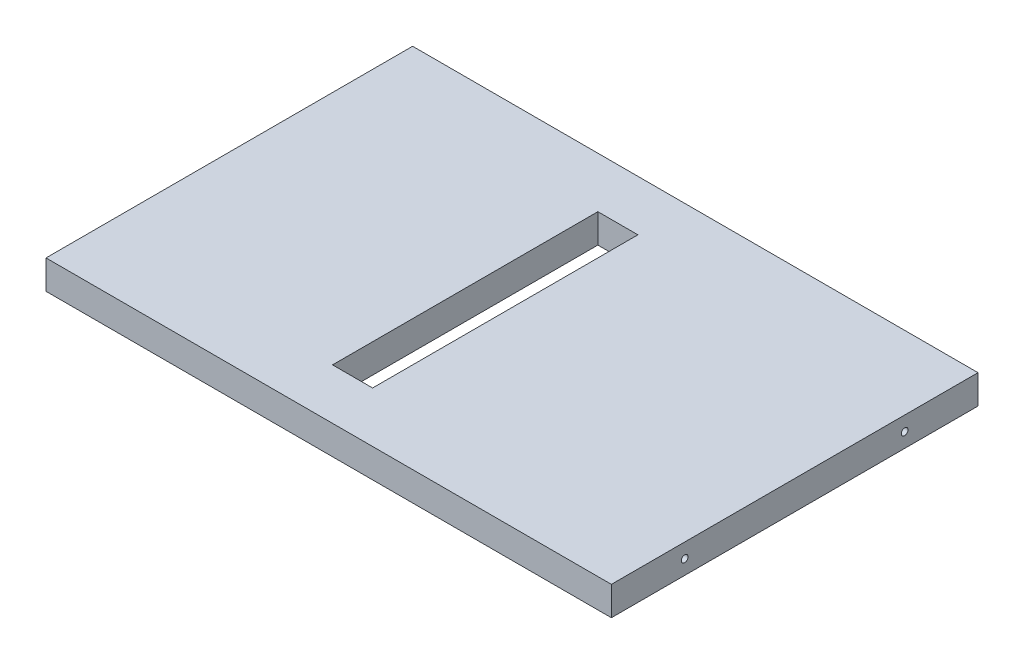
ISO-10303-21;
HEADER;
FILE_DESCRIPTION(('STEP AP214'),'2;1');
FILE_NAME('part.step','',(''),(''),'','','');
FILE_SCHEMA(('AUTOMOTIVE_DESIGN { 1 0 10303 214 1 1 1 1 }'));
ENDSEC;
DATA;
#1=APPLICATION_CONTEXT('core data for automotive mechanical design processes');
#2=APPLICATION_PROTOCOL_DEFINITION('international standard','automotive_design',2000,#1);
#3=PRODUCT_CONTEXT('',#1,'mechanical');
#4=PRODUCT('Part','Part','',(#3));
#5=PRODUCT_RELATED_PRODUCT_CATEGORY('part','',(#4));
#6=PRODUCT_DEFINITION_FORMATION('','',#4);
#7=PRODUCT_DEFINITION_CONTEXT('part definition',#1,'design');
#8=PRODUCT_DEFINITION('design','',#6,#7);
#9=PRODUCT_DEFINITION_SHAPE('','',#8);
#10=(LENGTH_UNIT() NAMED_UNIT(*) SI_UNIT(.MILLI.,.METRE.));
#11=(NAMED_UNIT(*) PLANE_ANGLE_UNIT() SI_UNIT($,.RADIAN.));
#12=(NAMED_UNIT(*) SI_UNIT($,.STERADIAN.) SOLID_ANGLE_UNIT());
#13=UNCERTAINTY_MEASURE_WITH_UNIT(LENGTH_MEASURE(1.E-05),#10,'distance_accuracy_value','');
#14=(GEOMETRIC_REPRESENTATION_CONTEXT(3) GLOBAL_UNCERTAINTY_ASSIGNED_CONTEXT((#13)) GLOBAL_UNIT_ASSIGNED_CONTEXT((#10,
#11,#12)) REPRESENTATION_CONTEXT('',''));
#15=CARTESIAN_POINT('',(0.,0.,0.));
#16=DIRECTION('',(0.,0.,1.));
#17=DIRECTION('',(1.,0.,0.));
#18=AXIS2_PLACEMENT_3D('',#15,#16,#17);
#19=CARTESIAN_POINT('',(-29.3,3.,19.));
#20=DIRECTION('',(-1.,0.,0.));
#21=DIRECTION('',(0.,0.,1.));
#22=AXIS2_PLACEMENT_3D('',#19,#20,#21);
#23=PLANE('',#22);
#24=DIRECTION('',(0.,0.,-1.));
#25=VECTOR('',#24,1.);
#26=CARTESIAN_POINT('',(-29.3,0.,19.));
#27=LINE('',#26,#25);
#28=CARTESIAN_POINT('',(-29.3,0.,19.));
#29=VERTEX_POINT('',#28);
#30=CARTESIAN_POINT('',(-29.3,0.,-19.));
#31=VERTEX_POINT('',#30);
#32=EDGE_CURVE('E141',#29,#31,#27,.T.);
#33=ORIENTED_EDGE('',*,*,#32,.F.);
#34=DIRECTION('',(0.,-1.,0.));
#35=VECTOR('',#34,1.);
#36=CARTESIAN_POINT('',(-29.3,3.,19.));
#37=LINE('',#36,#35);
#38=CARTESIAN_POINT('',(-29.3,3.,19.));
#39=VERTEX_POINT('',#38);
#40=EDGE_CURVE('E11',#39,#29,#37,.T.);
#41=ORIENTED_EDGE('',*,*,#40,.F.);
#42=DIRECTION('',(0.,0.,-1.));
#43=VECTOR('',#42,1.);
#44=CARTESIAN_POINT('',(-29.3,3.,19.));
#45=LINE('',#44,#43);
#46=CARTESIAN_POINT('',(-29.3,3.,-19.));
#47=VERTEX_POINT('',#46);
#48=EDGE_CURVE('E145',#39,#47,#45,.T.);
#49=ORIENTED_EDGE('',*,*,#48,.T.);
#50=DIRECTION('',(0.,-1.,0.));
#51=VECTOR('',#50,1.);
#52=CARTESIAN_POINT('',(-29.3,3.,-19.));
#53=LINE('',#52,#51);
#54=EDGE_CURVE('E42',#47,#31,#53,.T.);
#55=ORIENTED_EDGE('',*,*,#54,.T.);
#56=EDGE_LOOP('',(#33,#41,#49,#55));
#57=FACE_BOUND('',#56,.T.);
#58=ADVANCED_FACE('F39',(#57),#23,.T.);
#59=CARTESIAN_POINT('',(-29.3,3.,19.));
#60=DIRECTION('',(0.,0.,-1.));
#61=DIRECTION('',(-1.,0.,0.));
#62=AXIS2_PLACEMENT_3D('',#59,#60,#61);
#63=PLANE('',#62);
#64=DIRECTION('',(1.,0.,0.));
#65=VECTOR('',#64,1.);
#66=CARTESIAN_POINT('',(-29.3,0.,19.));
#67=LINE('',#66,#65);
#68=CARTESIAN_POINT('',(29.3,0.,19.));
#69=VERTEX_POINT('',#68);
#70=EDGE_CURVE('E149',#29,#69,#67,.T.);
#71=ORIENTED_EDGE('',*,*,#70,.T.);
#72=DIRECTION('',(0.,-1.,0.));
#73=VECTOR('',#72,1.);
#74=CARTESIAN_POINT('',(29.3,3.,19.));
#75=LINE('',#74,#73);
#76=CARTESIAN_POINT('',(29.3,3.,19.));
#77=VERTEX_POINT('',#76);
#78=EDGE_CURVE('E47',#77,#69,#75,.T.);
#79=ORIENTED_EDGE('',*,*,#78,.F.);
#80=DIRECTION('',(1.,0.,0.));
#81=VECTOR('',#80,1.);
#82=CARTESIAN_POINT('',(-29.3,3.,19.));
#83=LINE('',#82,#81);
#84=EDGE_CURVE('E154',#39,#77,#83,.T.);
#85=ORIENTED_EDGE('',*,*,#84,.F.);
#86=ORIENTED_EDGE('',*,*,#40,.T.);
#87=EDGE_LOOP('',(#71,#79,#85,#86));
#88=FACE_BOUND('',#87,.T.);
#89=ADVANCED_FACE('F181',(#88),#63,.F.);
#90=CARTESIAN_POINT('',(29.3,3.,19.));
#91=DIRECTION('',(-1.,0.,0.));
#92=DIRECTION('',(0.,0.,1.));
#93=AXIS2_PLACEMENT_3D('',#90,#91,#92);
#94=PLANE('',#93);
#95=CARTESIAN_POINT('',(29.3,1.49999999999998,11.3999999999999));
#96=DIRECTION('',(1.,0.,0.));
#97=DIRECTION('',(0.,0.,-1.));
#98=AXIS2_PLACEMENT_3D('',#95,#96,#97);
#99=CIRCLE('',#98,0.349999999999999);
#100=CARTESIAN_POINT('',(29.3,1.49999999999998,11.0499999999999));
#101=VERTEX_POINT('',#100);
#102=EDGE_CURVE('E213',#101,#101,#99,.T.);
#103=ORIENTED_EDGE('',*,*,#102,.F.);
#104=EDGE_LOOP('',(#103));
#105=FACE_BOUND('',#104,.T.);
#106=CARTESIAN_POINT('',(29.3,1.49999999999998,-11.4000000000001));
#107=DIRECTION('',(1.,0.,0.));
#108=DIRECTION('',(0.,0.,-1.));
#109=AXIS2_PLACEMENT_3D('',#106,#107,#108);
#110=CIRCLE('',#109,0.349999999999999);
#111=CARTESIAN_POINT('',(29.3,1.49999999999998,-11.7500000000001));
#112=VERTEX_POINT('',#111);
#113=EDGE_CURVE('E216',#112,#112,#110,.T.);
#114=ORIENTED_EDGE('',*,*,#113,.F.);
#115=EDGE_LOOP('',(#114));
#116=FACE_BOUND('',#115,.T.);
#117=DIRECTION('',(0.,0.,-1.));
#118=VECTOR('',#117,1.);
#119=CARTESIAN_POINT('',(29.3,0.,19.));
#120=LINE('',#119,#118);
#121=CARTESIAN_POINT('',(29.3,0.,-19.));
#122=VERTEX_POINT('',#121);
#123=EDGE_CURVE('E161',#69,#122,#120,.T.);
#124=ORIENTED_EDGE('',*,*,#123,.T.);
#125=DIRECTION('',(0.,-1.,0.));
#126=VECTOR('',#125,1.);
#127=CARTESIAN_POINT('',(29.3,3.,-19.));
#128=LINE('',#127,#126);
#129=CARTESIAN_POINT('',(29.3,3.,-19.));
#130=VERTEX_POINT('',#129);
#131=EDGE_CURVE('E166',#130,#122,#128,.T.);
#132=ORIENTED_EDGE('',*,*,#131,.F.);
#133=DIRECTION('',(0.,0.,-1.));
#134=VECTOR('',#133,1.);
#135=CARTESIAN_POINT('',(29.3,3.,19.));
#136=LINE('',#135,#134);
#137=EDGE_CURVE('E152',#77,#130,#136,.T.);
#138=ORIENTED_EDGE('',*,*,#137,.F.);
#139=ORIENTED_EDGE('',*,*,#78,.T.);
#140=EDGE_LOOP('',(#124,#132,#138,#139));
#141=FACE_BOUND('',#140,.T.);
#142=ADVANCED_FACE('F185',(#105,#116,#141),#94,.F.);
#143=CARTESIAN_POINT('',(-29.3,3.,-19.));
#144=DIRECTION('',(0.,0.,-1.));
#145=DIRECTION('',(-1.,0.,0.));
#146=AXIS2_PLACEMENT_3D('',#143,#144,#145);
#147=PLANE('',#146);
#148=DIRECTION('',(1.,0.,0.));
#149=VECTOR('',#148,1.);
#150=CARTESIAN_POINT('',(-29.3,0.,-19.));
#151=LINE('',#150,#149);
#152=EDGE_CURVE('E158',#31,#122,#151,.T.);
#153=ORIENTED_EDGE('',*,*,#152,.F.);
#154=ORIENTED_EDGE('',*,*,#54,.F.);
#155=DIRECTION('',(1.,0.,0.));
#156=VECTOR('',#155,1.);
#157=CARTESIAN_POINT('',(-29.3,3.,-19.));
#158=LINE('',#157,#156);
#159=EDGE_CURVE('E148',#47,#130,#158,.T.);
#160=ORIENTED_EDGE('',*,*,#159,.T.);
#161=ORIENTED_EDGE('',*,*,#131,.T.);
#162=EDGE_LOOP('',(#153,#154,#160,#161));
#163=FACE_BOUND('',#162,.T.);
#164=ADVANCED_FACE('F174',(#163),#147,.T.);
#165=CARTESIAN_POINT('',(0.,3.,0.));
#166=DIRECTION('',(0.,-1.,0.));
#167=DIRECTION('',(0.,0.,-1.));
#168=AXIS2_PLACEMENT_3D('',#165,#166,#167);
#169=PLANE('',#168);
#170=DIRECTION('',(1.,0.,0.));
#171=VECTOR('',#170,1.);
#172=CARTESIAN_POINT('',(-0.699999999999992,3.,-13.75));
#173=LINE('',#172,#171);
#174=CARTESIAN_POINT('',(-4.85000000000008,3.,-13.75));
#175=VERTEX_POINT('',#174);
#176=CARTESIAN_POINT('',(-0.699999999999992,3.,-13.75));
#177=VERTEX_POINT('',#176);
#178=EDGE_CURVE('E112',#175,#177,#173,.T.);
#179=ORIENTED_EDGE('',*,*,#178,.T.);
#180=DIRECTION('',(0.,0.,1.));
#181=VECTOR('',#180,1.);
#182=CARTESIAN_POINT('',(-0.699999999999992,3.,13.75));
#183=LINE('',#182,#181);
#184=CARTESIAN_POINT('',(-0.699999999999992,3.,13.75));
#185=VERTEX_POINT('',#184);
#186=EDGE_CURVE('E106',#177,#185,#183,.T.);
#187=ORIENTED_EDGE('',*,*,#186,.T.);
#188=DIRECTION('',(-1.,0.,0.));
#189=VECTOR('',#188,1.);
#190=CARTESIAN_POINT('',(-0.699999999999992,3.,13.75));
#191=LINE('',#190,#189);
#192=CARTESIAN_POINT('',(-4.85000000000008,3.,13.75));
#193=VERTEX_POINT('',#192);
#194=EDGE_CURVE('E115',#185,#193,#191,.T.);
#195=ORIENTED_EDGE('',*,*,#194,.T.);
#196=DIRECTION('',(0.,0.,-1.));
#197=VECTOR('',#196,1.);
#198=CARTESIAN_POINT('',(-4.85000000000008,3.,13.75));
#199=LINE('',#198,#197);
#200=EDGE_CURVE('E55',#193,#175,#199,.T.);
#201=ORIENTED_EDGE('',*,*,#200,.T.);
#202=EDGE_LOOP('',(#179,#187,#195,#201));
#203=FACE_BOUND('',#202,.T.);
#204=ORIENTED_EDGE('',*,*,#48,.F.);
#205=ORIENTED_EDGE('',*,*,#84,.T.);
#206=ORIENTED_EDGE('',*,*,#137,.T.);
#207=ORIENTED_EDGE('',*,*,#159,.F.);
#208=EDGE_LOOP('',(#204,#205,#206,#207));
#209=FACE_BOUND('',#208,.T.);
#210=ADVANCED_FACE('F119',(#203,#209),#169,.F.);
#211=CARTESIAN_POINT('',(0.,0.,0.));
#212=DIRECTION('',(0.,-1.,0.));
#213=DIRECTION('',(0.,0.,-1.));
#214=AXIS2_PLACEMENT_3D('',#211,#212,#213);
#215=PLANE('',#214);
#216=DIRECTION('',(0.,0.,1.));
#217=VECTOR('',#216,1.);
#218=CARTESIAN_POINT('',(-0.699999999999992,0.,13.75));
#219=LINE('',#218,#217);
#220=CARTESIAN_POINT('',(-0.699999999999992,0.,-13.75));
#221=VERTEX_POINT('',#220);
#222=CARTESIAN_POINT('',(-0.699999999999992,0.,13.75));
#223=VERTEX_POINT('',#222);
#224=EDGE_CURVE('E63',#221,#223,#219,.T.);
#225=ORIENTED_EDGE('',*,*,#224,.F.);
#226=DIRECTION('',(1.,0.,0.));
#227=VECTOR('',#226,1.);
#228=CARTESIAN_POINT('',(-0.699999999999992,0.,-13.75));
#229=LINE('',#228,#227);
#230=CARTESIAN_POINT('',(-4.85000000000008,0.,-13.75));
#231=VERTEX_POINT('',#230);
#232=EDGE_CURVE('E122',#231,#221,#229,.T.);
#233=ORIENTED_EDGE('',*,*,#232,.F.);
#234=DIRECTION('',(0.,0.,-1.));
#235=VECTOR('',#234,1.);
#236=CARTESIAN_POINT('',(-4.85000000000008,0.,13.75));
#237=LINE('',#236,#235);
#238=CARTESIAN_POINT('',(-4.85000000000008,0.,13.75));
#239=VERTEX_POINT('',#238);
#240=EDGE_CURVE('E125',#239,#231,#237,.T.);
#241=ORIENTED_EDGE('',*,*,#240,.F.);
#242=DIRECTION('',(-1.,0.,0.));
#243=VECTOR('',#242,1.);
#244=CARTESIAN_POINT('',(-0.699999999999992,0.,13.75));
#245=LINE('',#244,#243);
#246=EDGE_CURVE('E134',#223,#239,#245,.T.);
#247=ORIENTED_EDGE('',*,*,#246,.F.);
#248=EDGE_LOOP('',(#225,#233,#241,#247));
#249=FACE_BOUND('',#248,.T.);
#250=ORIENTED_EDGE('',*,*,#32,.T.);
#251=ORIENTED_EDGE('',*,*,#152,.T.);
#252=ORIENTED_EDGE('',*,*,#123,.F.);
#253=ORIENTED_EDGE('',*,*,#70,.F.);
#254=EDGE_LOOP('',(#250,#251,#252,#253));
#255=FACE_BOUND('',#254,.T.);
#256=ADVANCED_FACE('F178',(#249,#255),#215,.T.);
#257=CARTESIAN_POINT('',(-0.699999999999992,3.,13.75));
#258=DIRECTION('',(1.,0.,0.));
#259=DIRECTION('',(0.,0.,-1.));
#260=AXIS2_PLACEMENT_3D('',#257,#258,#259);
#261=PLANE('',#260);
#262=ORIENTED_EDGE('',*,*,#224,.T.);
#263=DIRECTION('',(0.,-1.,0.));
#264=VECTOR('',#263,1.);
#265=CARTESIAN_POINT('',(-0.699999999999992,3.,13.75));
#266=LINE('',#265,#264);
#267=EDGE_CURVE('E102',#185,#223,#266,.T.);
#268=ORIENTED_EDGE('',*,*,#267,.F.);
#269=ORIENTED_EDGE('',*,*,#186,.F.);
#270=DIRECTION('',(0.,-1.,0.));
#271=VECTOR('',#270,1.);
#272=CARTESIAN_POINT('',(-0.699999999999992,3.,-13.75));
#273=LINE('',#272,#271);
#274=EDGE_CURVE('E139',#177,#221,#273,.T.);
#275=ORIENTED_EDGE('',*,*,#274,.T.);
#276=EDGE_LOOP('',(#262,#268,#269,#275));
#277=FACE_BOUND('',#276,.T.);
#278=ADVANCED_FACE('F104',(#277),#261,.F.);
#279=CARTESIAN_POINT('',(-0.699999999999992,3.,-13.75));
#280=DIRECTION('',(0.,0.,-1.));
#281=DIRECTION('',(-1.,0.,0.));
#282=AXIS2_PLACEMENT_3D('',#279,#280,#281);
#283=PLANE('',#282);
#284=ORIENTED_EDGE('',*,*,#232,.T.);
#285=ORIENTED_EDGE('',*,*,#274,.F.);
#286=ORIENTED_EDGE('',*,*,#178,.F.);
#287=DIRECTION('',(0.,-1.,0.));
#288=VECTOR('',#287,1.);
#289=CARTESIAN_POINT('',(-4.85000000000008,3.,-13.75));
#290=LINE('',#289,#288);
#291=EDGE_CURVE('E142',#175,#231,#290,.T.);
#292=ORIENTED_EDGE('',*,*,#291,.T.);
#293=EDGE_LOOP('',(#284,#285,#286,#292));
#294=FACE_BOUND('',#293,.T.);
#295=ADVANCED_FACE('F243',(#294),#283,.F.);
#296=CARTESIAN_POINT('',(-4.85000000000008,3.,13.75));
#297=DIRECTION('',(-1.,0.,0.));
#298=DIRECTION('',(0.,0.,1.));
#299=AXIS2_PLACEMENT_3D('',#296,#297,#298);
#300=PLANE('',#299);
#301=ORIENTED_EDGE('',*,*,#240,.T.);
#302=ORIENTED_EDGE('',*,*,#291,.F.);
#303=ORIENTED_EDGE('',*,*,#200,.F.);
#304=DIRECTION('',(0.,-1.,0.));
#305=VECTOR('',#304,1.);
#306=CARTESIAN_POINT('',(-4.85000000000008,3.,13.75));
#307=LINE('',#306,#305);
#308=EDGE_CURVE('E111',#193,#239,#307,.T.);
#309=ORIENTED_EDGE('',*,*,#308,.T.);
#310=EDGE_LOOP('',(#301,#302,#303,#309));
#311=FACE_BOUND('',#310,.T.);
#312=ADVANCED_FACE('F246',(#311),#300,.F.);
#313=CARTESIAN_POINT('',(-0.699999999999992,3.,13.75));
#314=DIRECTION('',(0.,0.,1.));
#315=DIRECTION('',(1.,0.,0.));
#316=AXIS2_PLACEMENT_3D('',#313,#314,#315);
#317=PLANE('',#316);
#318=ORIENTED_EDGE('',*,*,#246,.T.);
#319=ORIENTED_EDGE('',*,*,#308,.F.);
#320=ORIENTED_EDGE('',*,*,#194,.F.);
#321=ORIENTED_EDGE('',*,*,#267,.T.);
#322=EDGE_LOOP('',(#318,#319,#320,#321));
#323=FACE_BOUND('',#322,.T.);
#324=ADVANCED_FACE('F116',(#323),#317,.F.);
#325=CARTESIAN_POINT('',(26.3,1.49999999999998,-11.4000000000001));
#326=DIRECTION('',(1.,0.,0.));
#327=DIRECTION('',(0.,0.,-1.));
#328=AXIS2_PLACEMENT_3D('',#325,#326,#327);
#329=CYLINDRICAL_SURFACE('',#328,0.349999999999999);
#330=CARTESIAN_POINT('',(26.3,1.49999999999998,-11.4000000000001));
#331=DIRECTION('',(1.,0.,0.));
#332=DIRECTION('',(0.,0.,-1.));
#333=AXIS2_PLACEMENT_3D('',#330,#331,#332);
#334=CIRCLE('',#333,0.349999999999999);
#335=CARTESIAN_POINT('',(26.3,1.49999999999998,-11.7500000000001));
#336=VERTEX_POINT('',#335);
#337=EDGE_CURVE('E128',#336,#336,#334,.T.);
#338=ORIENTED_EDGE('',*,*,#337,.F.);
#339=EDGE_LOOP('',(#338));
#340=FACE_BOUND('',#339,.T.);
#341=ORIENTED_EDGE('',*,*,#113,.T.);
#342=EDGE_LOOP('',(#341));
#343=FACE_BOUND('',#342,.T.);
#344=ADVANCED_FACE('F236',(#340,#343),#329,.F.);
#345=CARTESIAN_POINT('',(26.3,1.49999999999998,-11.4000000000001));
#346=DIRECTION('',(1.,0.,0.));
#347=DIRECTION('',(0.,0.,-1.));
#348=AXIS2_PLACEMENT_3D('',#345,#346,#347);
#349=PLANE('',#348);
#350=ORIENTED_EDGE('',*,*,#337,.T.);
#351=EDGE_LOOP('',(#350));
#352=FACE_BOUND('',#351,.T.);
#353=ADVANCED_FACE('F229',(#352),#349,.T.);
#354=CARTESIAN_POINT('',(26.3,1.49999999999998,11.3999999999999));
#355=DIRECTION('',(1.,0.,0.));
#356=DIRECTION('',(0.,0.,-1.));
#357=AXIS2_PLACEMENT_3D('',#354,#355,#356);
#358=CYLINDRICAL_SURFACE('',#357,0.349999999999999);
#359=CARTESIAN_POINT('',(26.3,1.49999999999998,11.3999999999999));
#360=DIRECTION('',(1.,0.,0.));
#361=DIRECTION('',(0.,0.,-1.));
#362=AXIS2_PLACEMENT_3D('',#359,#360,#361);
#363=CIRCLE('',#362,0.349999999999999);
#364=CARTESIAN_POINT('',(26.3,1.49999999999998,11.0499999999999));
#365=VERTEX_POINT('',#364);
#366=EDGE_CURVE('E135',#365,#365,#363,.T.);
#367=ORIENTED_EDGE('',*,*,#366,.F.);
#368=EDGE_LOOP('',(#367));
#369=FACE_BOUND('',#368,.T.);
#370=ORIENTED_EDGE('',*,*,#102,.T.);
#371=EDGE_LOOP('',(#370));
#372=FACE_BOUND('',#371,.T.);
#373=ADVANCED_FACE('F226',(#369,#372),#358,.F.);
#374=CARTESIAN_POINT('',(26.3,1.49999999999998,11.3999999999999));
#375=DIRECTION('',(1.,0.,0.));
#376=DIRECTION('',(0.,0.,-1.));
#377=AXIS2_PLACEMENT_3D('',#374,#375,#376);
#378=PLANE('',#377);
#379=ORIENTED_EDGE('',*,*,#366,.T.);
#380=EDGE_LOOP('',(#379));
#381=FACE_BOUND('',#380,.T.);
#382=ADVANCED_FACE('F224',(#381),#378,.T.);
#383=CLOSED_SHELL('',(#58,#89,#142,#164,#210,#256,#278,#295,#312,#324,#344,#353,#373,#382));
#384=MANIFOLD_SOLID_BREP('B2',#383);
#385=ADVANCED_BREP_SHAPE_REPRESENTATION('',(#18,#384),#14);
#386=SHAPE_DEFINITION_REPRESENTATION(#9,#385);
ENDSEC;
END-ISO-10303-21;
